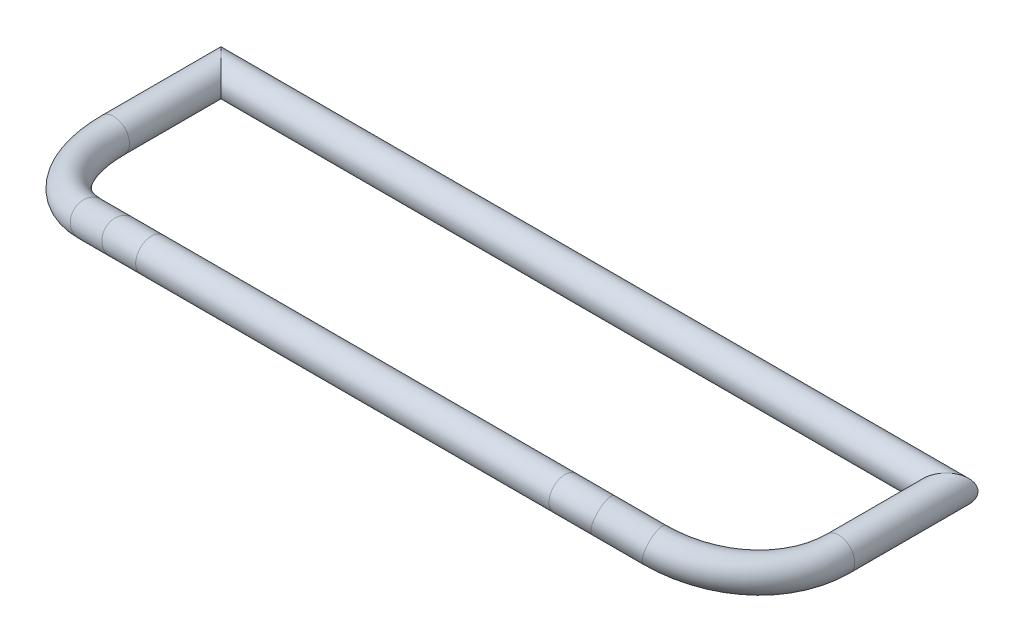
ISO-10303-21;
HEADER;
FILE_DESCRIPTION(('STEP AP214'),'2;1');
FILE_NAME('part.step','',(''),(''),'','','');
FILE_SCHEMA(('AUTOMOTIVE_DESIGN { 1 0 10303 214 1 1 1 1 }'));
ENDSEC;
DATA;
#1=APPLICATION_CONTEXT('core data for automotive mechanical design processes');
#2=APPLICATION_PROTOCOL_DEFINITION('international standard','automotive_design',2000,#1);
#3=PRODUCT_CONTEXT('',#1,'mechanical');
#4=PRODUCT('Part','Part','',(#3));
#5=PRODUCT_RELATED_PRODUCT_CATEGORY('part','',(#4));
#6=PRODUCT_DEFINITION_FORMATION('','',#4);
#7=PRODUCT_DEFINITION_CONTEXT('part definition',#1,'design');
#8=PRODUCT_DEFINITION('design','',#6,#7);
#9=PRODUCT_DEFINITION_SHAPE('','',#8);
#10=(LENGTH_UNIT() NAMED_UNIT(*) SI_UNIT(.MILLI.,.METRE.));
#11=(NAMED_UNIT(*) PLANE_ANGLE_UNIT() SI_UNIT($,.RADIAN.));
#12=(NAMED_UNIT(*) SI_UNIT($,.STERADIAN.) SOLID_ANGLE_UNIT());
#13=UNCERTAINTY_MEASURE_WITH_UNIT(LENGTH_MEASURE(1.E-05),#10,'distance_accuracy_value','');
#14=(GEOMETRIC_REPRESENTATION_CONTEXT(3) GLOBAL_UNCERTAINTY_ASSIGNED_CONTEXT((#13)) GLOBAL_UNIT_ASSIGNED_CONTEXT((#10,
#11,#12)) REPRESENTATION_CONTEXT('',''));
#15=CARTESIAN_POINT('',(0.,0.,0.));
#16=DIRECTION('',(0.,0.,1.));
#17=DIRECTION('',(1.,0.,0.));
#18=AXIS2_PLACEMENT_3D('',#15,#16,#17);
#19=CARTESIAN_POINT('',(193.824243161758,-39.5233843976709,-39.5233843976708));
#20=DIRECTION('',(0.,0.707106781186547,-0.707106781186548));
#21=DIRECTION('',(0.,0.707106781186548,0.707106781186547));
#22=AXIS2_PLACEMENT_3D('',#19,#20,#21);
#23=TOROIDAL_SURFACE('',#22,100.,15.);
#24=CARTESIAN_POINT('',(193.824243161758,31.1872937209839,31.1872937209839));
#25=DIRECTION('',(-1.,0.,0.));
#26=DIRECTION('',(0.,0.,1.));
#27=AXIS2_PLACEMENT_3D('',#24,#25,#26);
#28=CIRCLE('',#27,15.);
#29=CARTESIAN_POINT('',(193.824243161758,41.7938954387822,41.7938954387821));
#30=VERTEX_POINT('',#29);
#31=EDGE_CURVE('E64',#30,#30,#28,.T.);
#32=CARTESIAN_POINT('',(226.035142661291,27.4185977713352,27.4185977713351));
#33=DIRECTION('',(-0.94670259075546,0.227765454642377,0.22776545464238));
#34=DIRECTION('',(0.22776545464238,-0.0266487046222703,0.97335129537773));
#35=AXIS2_PLACEMENT_3D('',#32,#33,#34);
#36=CIRCLE('',#35,15.);
#37=CARTESIAN_POINT('',(230.866777586221,37.4598950966861,37.459895096686));
#38=VERTEX_POINT('',#37);
#39=EDGE_CURVE('E67',#38,#38,#36,.T.);
#40=CARTESIAN_POINT('',(193.824243161758,-39.5233843976709,-39.5233843976708));
#41=DIRECTION('',(0.,0.707106781186547,-0.707106781186548));
#42=DIRECTION('',(0.,0.707106781186548,0.707106781186547));
#43=AXIS2_PLACEMENT_3D('',#40,#41,#42);
#44=CIRCLE('',#43,115.);
#45=EDGE_CURVE('',#30,#38,#44,.T.);
#46=ORIENTED_EDGE('',*,*,#31,.F.);
#47=ORIENTED_EDGE('',*,*,#39,.T.);
#48=ORIENTED_EDGE('',*,*,#45,.T.);
#49=ORIENTED_EDGE('',*,*,#45,.F.);
#50=EDGE_LOOP('',(#46,#48,#47,#49));
#51=FACE_BOUND('',#50,.T.);
#52=ADVANCED_FACE('F49',(#51),#23,.T.);
#53=CARTESIAN_POINT('',(226.035142661291,27.4185977713351,27.4185977713352));
#54=DIRECTION('',(0.946702590755461,-0.227765454642378,-0.227765454642378));
#55=DIRECTION('',(-0.233913634730178,0.,-0.972257379240352));
#56=AXIS2_PLACEMENT_3D('',#53,#54,#55);
#57=CYLINDRICAL_SURFACE('',#56,15.);
#58=CARTESIAN_POINT('',(264.918926477173,18.0636189368807,18.0636189368808));
#59=DIRECTION('',(-0.94670259075546,0.227765454642377,0.227765454642381));
#60=DIRECTION('',(0.227765454642381,-0.0266487046222705,0.97335129537773));
#61=AXIS2_PLACEMENT_3D('',#58,#59,#60);
#62=CIRCLE('',#61,15.);
#63=CARTESIAN_POINT('',(268.240626137355,17.2644572564602,32.6693593144207));
#64=VERTEX_POINT('',#63);
#65=EDGE_CURVE('E70',#64,#64,#62,.T.);
#66=ORIENTED_EDGE('',*,*,#65,.T.);
#67=EDGE_LOOP('',(#66));
#68=FACE_BOUND('',#67,.T.);
#69=ORIENTED_EDGE('',*,*,#39,.F.);
#70=EDGE_LOOP('',(#69));
#71=FACE_BOUND('',#70,.T.);
#72=ADVANCED_FACE('F109',(#68,#71),#57,.T.);
#73=CARTESIAN_POINT('',(242.774262075965,23.3913634730177,-79.3079835800517));
#74=DIRECTION('',(0.233913634730178,0.972257379240351,0.));
#75=DIRECTION('',(-0.972257379240352,0.233913634730178,0.));
#76=AXIS2_PLACEMENT_3D('',#73,#74,#75);
#77=TOROIDAL_SURFACE('',#76,100.,15.);
#78=CARTESIAN_POINT('',(340.,0.,-79.3079835800517));
#79=DIRECTION('',(0.,0.,1.));
#80=DIRECTION('',(0.978294954853545,-0.207217232169766,0.));
#81=AXIS2_PLACEMENT_3D('',#78,#79,#80);
#82=CIRCLE('',#81,15.);
#83=CARTESIAN_POINT('',(354.583860688605,-3.50870452095275,-79.3079835800517));
#84=VERTEX_POINT('',#83);
#85=EDGE_CURVE('E73',#84,#84,#82,.T.);
#86=CARTESIAN_POINT('',(242.774262075965,23.3913634730177,-79.3079835800517));
#87=DIRECTION('',(0.233913634730178,0.972257379240351,0.));
#88=DIRECTION('',(-0.972257379240352,0.233913634730178,0.));
#89=AXIS2_PLACEMENT_3D('',#86,#87,#88);
#90=CIRCLE('',#89,115.);
#91=EDGE_CURVE('',#64,#84,#90,.T.);
#92=ORIENTED_EDGE('',*,*,#65,.F.);
#93=ORIENTED_EDGE('',*,*,#85,.T.);
#94=ORIENTED_EDGE('',*,*,#91,.T.);
#95=ORIENTED_EDGE('',*,*,#91,.F.);
#96=EDGE_LOOP('',(#92,#94,#93,#95));
#97=FACE_BOUND('',#96,.T.);
#98=ADVANCED_FACE('F113',(#97),#77,.T.);
#99=CARTESIAN_POINT('',(340.,0.,-79.3079835800517));
#100=DIRECTION('',(0.,0.,-1.));
#101=DIRECTION('',(0.,1.,0.));
#102=AXIS2_PLACEMENT_3D('',#99,#100,#101);
#103=CYLINDRICAL_SURFACE('',#102,15.);
#104=ORIENTED_EDGE('',*,*,#85,.F.);
#105=EDGE_LOOP('',(#104));
#106=FACE_BOUND('',#105,.T.);
#107=CARTESIAN_POINT('',(340.,0.,-180.));
#108=DIRECTION('',(-0.707106781186547,0.,-0.707106781186547));
#109=DIRECTION('',(-0.707106781186548,0.,0.707106781186548));
#110=AXIS2_PLACEMENT_3D('',#107,#108,#109);
#111=ELLIPSE('',#110,21.2132034355964,15.);
#112=CARTESIAN_POINT('',(325.,0.,-165.));
#113=VERTEX_POINT('',#112);
#114=EDGE_CURVE('E57',#113,#113,#111,.T.);
#115=ORIENTED_EDGE('',*,*,#114,.F.);
#116=EDGE_LOOP('',(#115));
#117=FACE_BOUND('',#116,.T.);
#118=ADVANCED_FACE('F117',(#106,#117),#103,.T.);
#119=CARTESIAN_POINT('',(-193.824243161758,31.187293720984,31.187293720984));
#120=DIRECTION('',(1.,0.,0.));
#121=DIRECTION('',(0.,0.,-1.));
#122=AXIS2_PLACEMENT_3D('',#119,#120,#121);
#123=CYLINDRICAL_SURFACE('',#122,15.);
#124=CARTESIAN_POINT('',(-193.824243161758,31.187293720984,31.1872937209839));
#125=DIRECTION('',(-1.,0.,0.));
#126=DIRECTION('',(0.,0.,1.));
#127=AXIS2_PLACEMENT_3D('',#124,#125,#126);
#128=CIRCLE('',#127,15.);
#129=CARTESIAN_POINT('',(-193.824243161758,41.7938954387822,41.7938954387821));
#130=VERTEX_POINT('',#129);
#131=EDGE_CURVE('E76',#130,#130,#128,.T.);
#132=ORIENTED_EDGE('',*,*,#131,.F.);
#133=EDGE_LOOP('',(#132));
#134=FACE_BOUND('',#133,.T.);
#135=ORIENTED_EDGE('',*,*,#31,.T.);
#136=EDGE_LOOP('',(#135));
#137=FACE_BOUND('',#136,.T.);
#138=ADVANCED_FACE('F121',(#134,#137),#123,.T.);
#139=CARTESIAN_POINT('',(-193.824243161758,-39.5233843976708,-39.5233843976708));
#140=DIRECTION('',(0.,0.707106781186547,-0.707106781186548));
#141=DIRECTION('',(0.,0.707106781186548,0.707106781186547));
#142=AXIS2_PLACEMENT_3D('',#139,#140,#141);
#143=TOROIDAL_SURFACE('',#142,100.,15.);
#144=CARTESIAN_POINT('',(-226.035142661291,27.4185977713351,27.4185977713352));
#145=DIRECTION('',(-0.946702590755461,-0.227765454642379,-0.227765454642375));
#146=DIRECTION('',(-0.227765454642375,-0.0266487046222688,0.973351295377731));
#147=AXIS2_PLACEMENT_3D('',#144,#145,#146);
#148=CIRCLE('',#147,15.);
#149=CARTESIAN_POINT('',(-230.866777586221,37.459895096686,37.4598950966861));
#150=VERTEX_POINT('',#149);
#151=EDGE_CURVE('E79',#150,#150,#148,.T.);
#152=CARTESIAN_POINT('',(-193.824243161758,-39.5233843976708,-39.5233843976708));
#153=DIRECTION('',(0.,0.707106781186547,-0.707106781186548));
#154=DIRECTION('',(0.,0.707106781186548,0.707106781186547));
#155=AXIS2_PLACEMENT_3D('',#152,#153,#154);
#156=CIRCLE('',#155,115.);
#157=EDGE_CURVE('',#150,#130,#156,.T.);
#158=ORIENTED_EDGE('',*,*,#151,.F.);
#159=ORIENTED_EDGE('',*,*,#131,.T.);
#160=ORIENTED_EDGE('',*,*,#157,.T.);
#161=ORIENTED_EDGE('',*,*,#157,.F.);
#162=EDGE_LOOP('',(#158,#160,#159,#161));
#163=FACE_BOUND('',#162,.T.);
#164=ADVANCED_FACE('F97',(#163),#143,.T.);
#165=CARTESIAN_POINT('',(-264.918926477173,18.0636189368807,18.0636189368808));
#166=DIRECTION('',(0.946702590755461,0.227765454642378,0.227765454642378));
#167=DIRECTION('',(0.233913634730178,0.,-0.972257379240352));
#168=AXIS2_PLACEMENT_3D('',#165,#166,#167);
#169=CYLINDRICAL_SURFACE('',#168,15.);
#170=ORIENTED_EDGE('',*,*,#151,.T.);
#171=EDGE_LOOP('',(#170));
#172=FACE_BOUND('',#171,.T.);
#173=CARTESIAN_POINT('',(-264.918926477173,18.0636189368808,18.0636189368809));
#174=DIRECTION('',(-0.946702590755461,-0.22776545464238,-0.227765454642375));
#175=DIRECTION('',(-0.227765454642375,-0.0266487046222688,0.973351295377731));
#176=AXIS2_PLACEMENT_3D('',#173,#174,#175);
#177=CIRCLE('',#176,15.);
#178=CARTESIAN_POINT('',(-268.240626137355,17.2644572564602,32.6693593144207));
#179=VERTEX_POINT('',#178);
#180=EDGE_CURVE('E81',#179,#179,#177,.T.);
#181=ORIENTED_EDGE('',*,*,#180,.F.);
#182=EDGE_LOOP('',(#181));
#183=FACE_BOUND('',#182,.T.);
#184=ADVANCED_FACE('F91',(#172,#183),#169,.T.);
#185=CARTESIAN_POINT('',(-242.774262075965,23.3913634730178,-79.3079835800517));
#186=DIRECTION('',(-0.233913634730178,0.972257379240352,0.));
#187=DIRECTION('',(-0.972257379240352,-0.233913634730178,0.));
#188=AXIS2_PLACEMENT_3D('',#185,#186,#187);
#189=TOROIDAL_SURFACE('',#188,100.,15.);
#190=CARTESIAN_POINT('',(-340.,0.,-79.3079835800517));
#191=DIRECTION('',(0.,0.,-1.));
#192=DIRECTION('',(-0.978294954853546,-0.207217232169766,0.));
#193=AXIS2_PLACEMENT_3D('',#190,#191,#192);
#194=CIRCLE('',#193,15.);
#195=CARTESIAN_POINT('',(-354.583860688605,-3.50870452095267,-79.3079835800517));
#196=VERTEX_POINT('',#195);
#197=EDGE_CURVE('E53',#196,#196,#194,.T.);
#198=CARTESIAN_POINT('',(-242.774262075965,23.3913634730178,-79.3079835800517));
#199=DIRECTION('',(-0.233913634730178,0.972257379240352,0.));
#200=DIRECTION('',(-0.972257379240352,-0.233913634730178,0.));
#201=AXIS2_PLACEMENT_3D('',#198,#199,#200);
#202=CIRCLE('',#201,115.);
#203=EDGE_CURVE('',#196,#179,#202,.T.);
#204=ORIENTED_EDGE('',*,*,#197,.F.);
#205=ORIENTED_EDGE('',*,*,#180,.T.);
#206=ORIENTED_EDGE('',*,*,#203,.T.);
#207=ORIENTED_EDGE('',*,*,#203,.F.);
#208=EDGE_LOOP('',(#204,#206,#205,#207));
#209=FACE_BOUND('',#208,.T.);
#210=ADVANCED_FACE('F89',(#209),#189,.T.);
#211=CARTESIAN_POINT('',(-340.,0.,-203.080035416686));
#212=DIRECTION('',(0.,0.,1.));
#213=DIRECTION('',(0.,-1.,0.));
#214=AXIS2_PLACEMENT_3D('',#211,#212,#213);
#215=CYLINDRICAL_SURFACE('',#214,15.);
#216=CARTESIAN_POINT('',(-340.,0.,-180.));
#217=DIRECTION('',(-0.707106781186547,0.,0.707106781186547));
#218=DIRECTION('',(-0.707106781186548,0.,-0.707106781186548));
#219=AXIS2_PLACEMENT_3D('',#216,#217,#218);
#220=ELLIPSE('',#219,21.2132034355964,15.);
#221=CARTESIAN_POINT('',(-355.,0.,-195.));
#222=VERTEX_POINT('',#221);
#223=EDGE_CURVE('E11',#222,#222,#220,.T.);
#224=ORIENTED_EDGE('',*,*,#223,.T.);
#225=EDGE_LOOP('',(#224));
#226=FACE_BOUND('',#225,.T.);
#227=ORIENTED_EDGE('',*,*,#197,.T.);
#228=EDGE_LOOP('',(#227));
#229=FACE_BOUND('',#228,.T.);
#230=ADVANCED_FACE('F51',(#226,#229),#215,.T.);
#231=CARTESIAN_POINT('',(363.080035416686,0.,-180.));
#232=DIRECTION('',(-1.,0.,0.));
#233=DIRECTION('',(0.,0.,1.));
#234=AXIS2_PLACEMENT_3D('',#231,#232,#233);
#235=CYLINDRICAL_SURFACE('',#234,15.);
#236=ORIENTED_EDGE('',*,*,#114,.T.);
#237=EDGE_LOOP('',(#236));
#238=FACE_BOUND('',#237,.T.);
#239=ORIENTED_EDGE('',*,*,#223,.F.);
#240=EDGE_LOOP('',(#239));
#241=FACE_BOUND('',#240,.T.);
#242=ADVANCED_FACE('F96',(#238,#241),#235,.T.);
#243=CLOSED_SHELL('',(#52,#72,#98,#118,#138,#164,#184,#210,#230,#242));
#244=MANIFOLD_SOLID_BREP('B2',#243);
#245=ADVANCED_BREP_SHAPE_REPRESENTATION('',(#18,#244),#14);
#246=SHAPE_DEFINITION_REPRESENTATION(#9,#245);
ENDSEC;
END-ISO-10303-21;
